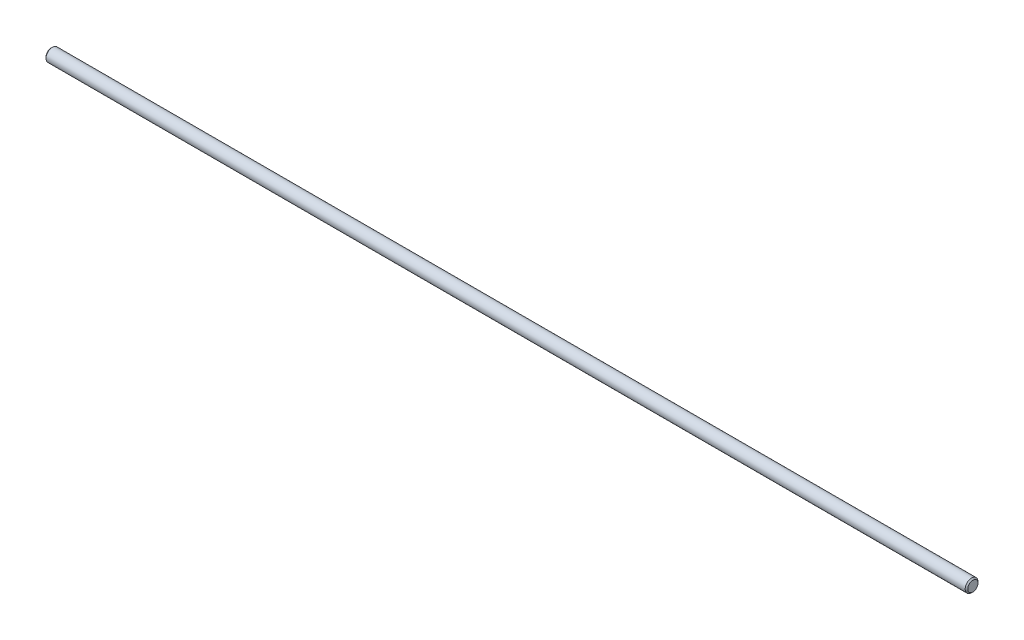
ISO-10303-21;
HEADER;
FILE_DESCRIPTION(('STEP AP214'),'2;1');
FILE_NAME('part.step','',(''),(''),'','','');
FILE_SCHEMA(('AUTOMOTIVE_DESIGN { 1 0 10303 214 1 1 1 1 }'));
ENDSEC;
DATA;
#1=APPLICATION_CONTEXT('core data for automotive mechanical design processes');
#2=APPLICATION_PROTOCOL_DEFINITION('international standard','automotive_design',2000,#1);
#3=PRODUCT_CONTEXT('',#1,'mechanical');
#4=PRODUCT('Part','Part','',(#3));
#5=PRODUCT_RELATED_PRODUCT_CATEGORY('part','',(#4));
#6=PRODUCT_DEFINITION_FORMATION('','',#4);
#7=PRODUCT_DEFINITION_CONTEXT('part definition',#1,'design');
#8=PRODUCT_DEFINITION('design','',#6,#7);
#9=PRODUCT_DEFINITION_SHAPE('','',#8);
#10=(LENGTH_UNIT() NAMED_UNIT(*) SI_UNIT(.MILLI.,.METRE.));
#11=(NAMED_UNIT(*) PLANE_ANGLE_UNIT() SI_UNIT($,.RADIAN.));
#12=(NAMED_UNIT(*) SI_UNIT($,.STERADIAN.) SOLID_ANGLE_UNIT());
#13=UNCERTAINTY_MEASURE_WITH_UNIT(LENGTH_MEASURE(1.E-05),#10,'distance_accuracy_value','');
#14=(GEOMETRIC_REPRESENTATION_CONTEXT(3) GLOBAL_UNCERTAINTY_ASSIGNED_CONTEXT((#13)) GLOBAL_UNIT_ASSIGNED_CONTEXT((#10,
#11,#12)) REPRESENTATION_CONTEXT('',''));
#15=CARTESIAN_POINT('',(0.,0.,0.));
#16=DIRECTION('',(0.,0.,1.));
#17=DIRECTION('',(1.,0.,0.));
#18=AXIS2_PLACEMENT_3D('',#15,#16,#17);
#19=CARTESIAN_POINT('',(-228.6,0.,0.));
#20=DIRECTION('',(1.,0.,0.));
#21=DIRECTION('',(0.,0.,-1.));
#22=AXIS2_PLACEMENT_3D('',#19,#20,#21);
#23=CYLINDRICAL_SURFACE('',#22,3.175);
#24=CARTESIAN_POINT('',(227.965,0.,0.));
#25=DIRECTION('',(1.,0.,0.));
#26=DIRECTION('',(0.,0.,-1.));
#27=AXIS2_PLACEMENT_3D('',#24,#25,#26);
#28=CIRCLE('',#27,3.175);
#29=CARTESIAN_POINT('',(227.965,0.,-3.175));
#30=VERTEX_POINT('',#29);
#31=EDGE_CURVE('E37',#30,#30,#28,.F.);
#32=CARTESIAN_POINT('',(-227.965,0.,0.));
#33=DIRECTION('',(1.,0.,0.));
#34=DIRECTION('',(0.,0.,-1.));
#35=AXIS2_PLACEMENT_3D('',#32,#33,#34);
#36=CIRCLE('',#35,3.175);
#37=CARTESIAN_POINT('',(-227.965,0.,-3.175));
#38=VERTEX_POINT('',#37);
#39=EDGE_CURVE('E41',#38,#38,#36,.T.);
#40=CARTESIAN_POINT('',(227.965,0.,-3.175));
#41=CARTESIAN_POINT('',(223.215729166667,0.,-3.175));
#42=CARTESIAN_POINT('',(218.466458333333,0.,-3.175));
#43=CARTESIAN_POINT('',(208.967916666667,0.,-3.175));
#44=CARTESIAN_POINT('',(204.218645833333,0.,-3.175));
#45=CARTESIAN_POINT('',(194.720104166667,0.,-3.175));
#46=CARTESIAN_POINT('',(189.970833333333,0.,-3.175));
#47=CARTESIAN_POINT('',(180.472291666667,0.,-3.175));
#48=CARTESIAN_POINT('',(175.723020833333,0.,-3.175));
#49=CARTESIAN_POINT('',(166.224479166667,0.,-3.175));
#50=CARTESIAN_POINT('',(161.475208333333,0.,-3.175));
#51=CARTESIAN_POINT('',(151.976666666667,0.,-3.175));
#52=CARTESIAN_POINT('',(147.227395833333,0.,-3.175));
#53=CARTESIAN_POINT('',(137.728854166667,0.,-3.175));
#54=CARTESIAN_POINT('',(132.979583333333,0.,-3.175));
#55=CARTESIAN_POINT('',(123.481041666667,0.,-3.175));
#56=CARTESIAN_POINT('',(118.731770833333,0.,-3.175));
#57=CARTESIAN_POINT('',(109.233229166667,0.,-3.175));
#58=CARTESIAN_POINT('',(104.483958333333,0.,-3.175));
#59=CARTESIAN_POINT('',(94.9854166666666,0.,-3.175));
#60=CARTESIAN_POINT('',(90.2361458333333,0.,-3.175));
#61=CARTESIAN_POINT('',(80.7376041666666,0.,-3.175));
#62=CARTESIAN_POINT('',(75.9883333333333,0.,-3.175));
#63=CARTESIAN_POINT('',(66.4897916666666,0.,-3.175));
#64=CARTESIAN_POINT('',(61.7405208333333,0.,-3.175));
#65=CARTESIAN_POINT('',(52.2419791666667,0.,-3.175));
#66=CARTESIAN_POINT('',(47.4927083333333,0.,-3.175));
#67=CARTESIAN_POINT('',(37.9941666666666,0.,-3.175));
#68=CARTESIAN_POINT('',(33.2448958333333,0.,-3.175));
#69=CARTESIAN_POINT('',(23.7463541666666,0.,-3.175));
#70=CARTESIAN_POINT('',(18.9970833333333,0.,-3.175));
#71=CARTESIAN_POINT('',(9.49854166666668,0.,-3.175));
#72=CARTESIAN_POINT('',(4.74927083333336,0.,-3.175));
#73=CARTESIAN_POINT('',(-4.7492708333333,0.,-3.175));
#74=CARTESIAN_POINT('',(-9.49854166666663,0.,-3.175));
#75=CARTESIAN_POINT('',(-18.9970833333333,0.,-3.175));
#76=CARTESIAN_POINT('',(-23.7463541666666,0.,-3.175));
#77=CARTESIAN_POINT('',(-33.2448958333333,0.,-3.175));
#78=CARTESIAN_POINT('',(-37.9941666666666,0.,-3.175));
#79=CARTESIAN_POINT('',(-47.4927083333333,0.,-3.175));
#80=CARTESIAN_POINT('',(-52.2419791666666,0.,-3.175));
#81=CARTESIAN_POINT('',(-61.7405208333333,0.,-3.175));
#82=CARTESIAN_POINT('',(-66.4897916666666,0.,-3.175));
#83=CARTESIAN_POINT('',(-75.9883333333333,0.,-3.175));
#84=CARTESIAN_POINT('',(-80.7376041666666,0.,-3.175));
#85=CARTESIAN_POINT('',(-90.2361458333333,0.,-3.175));
#86=CARTESIAN_POINT('',(-94.9854166666666,0.,-3.175));
#87=CARTESIAN_POINT('',(-104.483958333333,0.,-3.175));
#88=CARTESIAN_POINT('',(-109.233229166667,0.,-3.175));
#89=CARTESIAN_POINT('',(-118.731770833333,0.,-3.175));
#90=CARTESIAN_POINT('',(-123.481041666667,0.,-3.175));
#91=CARTESIAN_POINT('',(-132.979583333333,0.,-3.175));
#92=CARTESIAN_POINT('',(-137.728854166667,0.,-3.175));
#93=CARTESIAN_POINT('',(-147.227395833333,0.,-3.175));
#94=CARTESIAN_POINT('',(-151.976666666667,0.,-3.175));
#95=CARTESIAN_POINT('',(-161.475208333333,0.,-3.175));
#96=CARTESIAN_POINT('',(-166.224479166667,0.,-3.175));
#97=CARTESIAN_POINT('',(-175.723020833333,0.,-3.175));
#98=CARTESIAN_POINT('',(-180.472291666667,0.,-3.175));
#99=CARTESIAN_POINT('',(-189.970833333333,0.,-3.175));
#100=CARTESIAN_POINT('',(-194.720104166667,0.,-3.175));
#101=CARTESIAN_POINT('',(-204.218645833333,0.,-3.175));
#102=CARTESIAN_POINT('',(-208.967916666667,0.,-3.175));
#103=CARTESIAN_POINT('',(-218.466458333333,0.,-3.175));
#104=CARTESIAN_POINT('',(-223.215729166667,0.,-3.175));
#105=CARTESIAN_POINT('',(-227.965,0.,-3.175));
#106=B_SPLINE_CURVE_WITH_KNOTS('',3,(#40,#41,#42,#43,#44,#45,#46,#47,#48,#49,#50,#51,#52,#53,
#54,#55,#56,#57,#58,#59,#60,#61,#62,#63,#64,#65,#66,#67,#68,#69,#70,#71,#72,#73,#74,#75,#76,#77,
#78,#79,#80,#81,#82,#83,#84,#85,#86,#87,#88,#89,#90,#91,#92,#93,#94,#95,#96,#97,#98,#99,#100,
#101,#102,#103,#104,#105),.UNSPECIFIED.,.F.,.F.,(4,2,2,2,2,2,2,2,2,2,2,2,2,2,2,2,2,2,2,2,2,2,2,
2,2,2,2,2,2,2,2,2,4),(0.,14.2478125,28.495625,42.7434375,56.99125,71.2390625,85.486875,
99.7346875,113.9825,128.2303125,142.478125,156.7259375,170.97375,185.2215625,199.469375,
213.7171875,227.965,242.2128125,256.460625,270.7084375,284.95625,299.2040625,313.451875,
327.6996875,341.9475,356.1953125,370.443125,384.6909375,398.93875,413.1865625,427.434375,
441.6821875,455.93),.UNSPECIFIED.);
#107=EDGE_CURVE('BSEAM30',#30,#38,#106,.T.);
#108=ORIENTED_EDGE('',*,*,#31,.T.);
#109=ORIENTED_EDGE('',*,*,#39,.T.);
#110=ORIENTED_EDGE('',*,*,#107,.T.);
#111=ORIENTED_EDGE('',*,*,#107,.F.);
#112=EDGE_LOOP('',(#108,#110,#109,#111));
#113=FACE_BOUND('',#112,.T.);
#114=ADVANCED_FACE('F30',(#113),#23,.T.);
#115=CARTESIAN_POINT('',(-228.6,0.,0.));
#116=DIRECTION('',(1.,0.,0.));
#117=DIRECTION('',(0.,0.,-1.));
#118=AXIS2_PLACEMENT_3D('',#115,#116,#117);
#119=PLANE('',#118);
#120=CARTESIAN_POINT('',(-228.6,0.,0.));
#121=DIRECTION('',(1.,0.,0.));
#122=DIRECTION('',(0.,0.,-1.));
#123=AXIS2_PLACEMENT_3D('',#120,#121,#122);
#124=CIRCLE('',#123,2.53999999999982);
#125=CARTESIAN_POINT('',(-228.6,0.,-2.53999999999982));
#126=VERTEX_POINT('',#125);
#127=EDGE_CURVE('E10',#126,#126,#124,.F.);
#128=ORIENTED_EDGE('',*,*,#127,.T.);
#129=EDGE_LOOP('',(#128));
#130=FACE_BOUND('',#129,.T.);
#131=ADVANCED_FACE('F61',(#130),#119,.F.);
#132=CARTESIAN_POINT('',(228.6,0.,0.));
#133=DIRECTION('',(1.,0.,0.));
#134=DIRECTION('',(0.,0.,-1.));
#135=AXIS2_PLACEMENT_3D('',#132,#133,#134);
#136=PLANE('',#135);
#137=CARTESIAN_POINT('',(228.6,0.,0.));
#138=DIRECTION('',(1.,0.,0.));
#139=DIRECTION('',(0.,0.,-1.));
#140=AXIS2_PLACEMENT_3D('',#137,#138,#139);
#141=CIRCLE('',#140,2.54000000000004);
#142=CARTESIAN_POINT('',(228.6,0.,-2.54000000000004));
#143=VERTEX_POINT('',#142);
#144=EDGE_CURVE('E45',#143,#143,#141,.T.);
#145=ORIENTED_EDGE('',*,*,#144,.T.);
#146=EDGE_LOOP('',(#145));
#147=FACE_BOUND('',#146,.T.);
#148=ADVANCED_FACE('F51',(#147),#136,.T.);
#149=CARTESIAN_POINT('',(228.6,0.,0.));
#150=DIRECTION('',(-1.,0.,0.));
#151=DIRECTION('',(0.,0.,1.));
#152=AXIS2_PLACEMENT_3D('',#149,#150,#151);
#153=CONICAL_SURFACE('',#152,2.54000000000004,0.785398163397463);
#154=ORIENTED_EDGE('',*,*,#31,.F.);
#155=EDGE_LOOP('',(#154));
#156=FACE_BOUND('',#155,.T.);
#157=ORIENTED_EDGE('',*,*,#144,.F.);
#158=EDGE_LOOP('',(#157));
#159=FACE_BOUND('',#158,.T.);
#160=ADVANCED_FACE('F53',(#156,#159),#153,.T.);
#161=CARTESIAN_POINT('',(-227.965,0.,0.));
#162=DIRECTION('',(1.,0.,0.));
#163=DIRECTION('',(0.,0.,-1.));
#164=AXIS2_PLACEMENT_3D('',#161,#162,#163);
#165=CONICAL_SURFACE('',#164,3.175,0.785398163397441);
#166=ORIENTED_EDGE('',*,*,#127,.F.);
#167=EDGE_LOOP('',(#166));
#168=FACE_BOUND('',#167,.T.);
#169=ORIENTED_EDGE('',*,*,#39,.F.);
#170=EDGE_LOOP('',(#169));
#171=FACE_BOUND('',#170,.T.);
#172=ADVANCED_FACE('F32',(#168,#171),#165,.T.);
#173=CLOSED_SHELL('',(#114,#131,#148,#160,#172));
#174=MANIFOLD_SOLID_BREP('B2',#173);
#175=ADVANCED_BREP_SHAPE_REPRESENTATION('',(#18,#174),#14);
#176=SHAPE_DEFINITION_REPRESENTATION(#9,#175);
ENDSEC;
END-ISO-10303-21;
